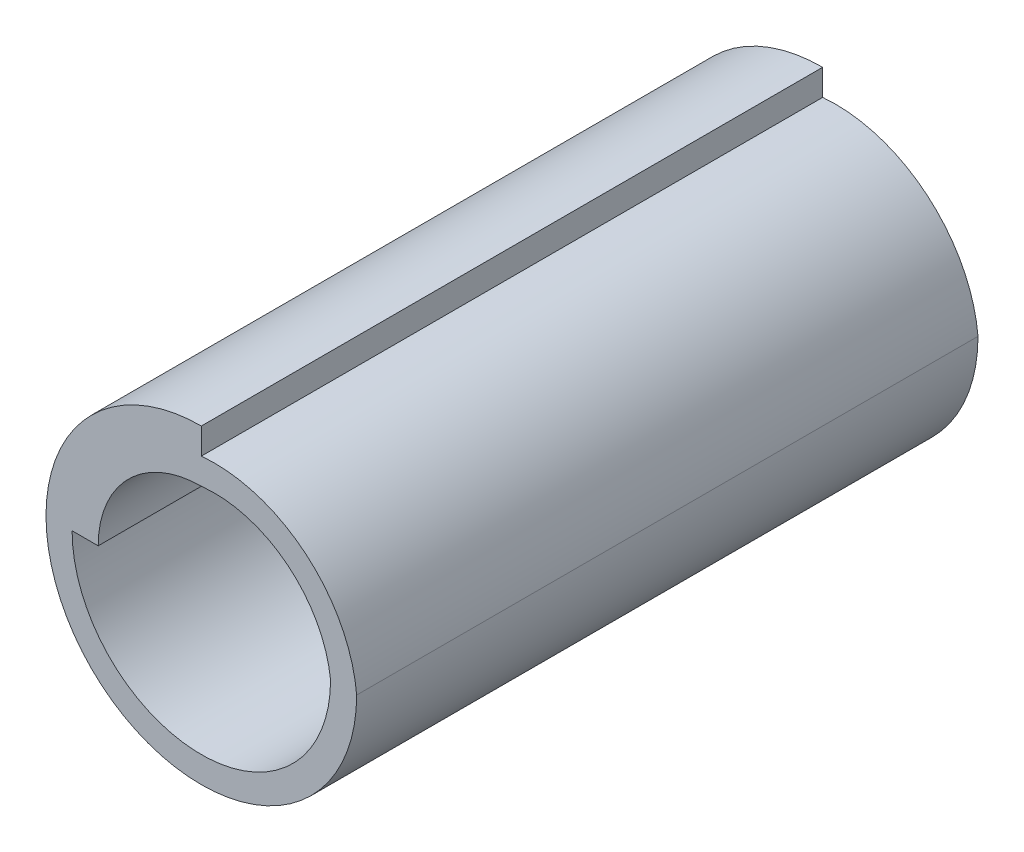
ISO-10303-21;
HEADER;
FILE_DESCRIPTION(('STEP AP214'),'2;1');
FILE_NAME('part.step','',(''),(''),'','','');
FILE_SCHEMA(('AUTOMOTIVE_DESIGN { 1 0 10303 214 1 1 1 1 }'));
ENDSEC;
DATA;
#1=APPLICATION_CONTEXT('core data for automotive mechanical design processes');
#2=APPLICATION_PROTOCOL_DEFINITION('international standard','automotive_design',2000,#1);
#3=PRODUCT_CONTEXT('',#1,'mechanical');
#4=PRODUCT('Part','Part','',(#3));
#5=PRODUCT_RELATED_PRODUCT_CATEGORY('part','',(#4));
#6=PRODUCT_DEFINITION_FORMATION('','',#4);
#7=PRODUCT_DEFINITION_CONTEXT('part definition',#1,'design');
#8=PRODUCT_DEFINITION('design','',#6,#7);
#9=PRODUCT_DEFINITION_SHAPE('','',#8);
#10=(LENGTH_UNIT() NAMED_UNIT(*) SI_UNIT(.MILLI.,.METRE.));
#11=(NAMED_UNIT(*) PLANE_ANGLE_UNIT() SI_UNIT($,.RADIAN.));
#12=(NAMED_UNIT(*) SI_UNIT($,.STERADIAN.) SOLID_ANGLE_UNIT());
#13=UNCERTAINTY_MEASURE_WITH_UNIT(LENGTH_MEASURE(1.E-05),#10,'distance_accuracy_value','');
#14=(GEOMETRIC_REPRESENTATION_CONTEXT(3) GLOBAL_UNCERTAINTY_ASSIGNED_CONTEXT((#13)) GLOBAL_UNIT_ASSIGNED_CONTEXT((#10,
#11,#12)) REPRESENTATION_CONTEXT('',''));
#15=CARTESIAN_POINT('',(0.,0.,0.));
#16=DIRECTION('',(0.,0.,1.));
#17=DIRECTION('',(1.,0.,0.));
#18=AXIS2_PLACEMENT_3D('',#15,#16,#17);
#19=CARTESIAN_POINT('',(0.420000000000019,-0.419999999999977,10.));
#20=DIRECTION('',(0.,0.,1.));
#21=DIRECTION('',(1.,0.,0.));
#22=AXIS2_PLACEMENT_3D('',#19,#20,#21);
#23=PLANE('',#22);
#24=CARTESIAN_POINT('',(0.420000000000019,-0.419999999999977,10.));
#25=DIRECTION('',(0.,0.,1.));
#26=DIRECTION('',(1.,0.,0.));
#27=AXIS2_PLACEMENT_3D('',#24,#25,#26);
#28=CIRCLE('',#27,4.59921732471948);
#29=CARTESIAN_POINT('',(5.,0.,10.));
#30=VERTEX_POINT('',#29);
#31=CARTESIAN_POINT('',(0.,4.16,10.));
#32=VERTEX_POINT('',#31);
#33=EDGE_CURVE('E134',#30,#32,#28,.T.);
#34=ORIENTED_EDGE('',*,*,#33,.T.);
#35=DIRECTION('',(0.,1.,0.));
#36=VECTOR('',#35,1.);
#37=CARTESIAN_POINT('',(0.,4.16,10.));
#38=LINE('',#37,#36);
#39=CARTESIAN_POINT('',(0.,5.,10.));
#40=VERTEX_POINT('',#39);
#41=EDGE_CURVE('E137',#32,#40,#38,.T.);
#42=ORIENTED_EDGE('',*,*,#41,.T.);
#43=CARTESIAN_POINT('',(0.,0.,10.));
#44=DIRECTION('',(0.,0.,1.));
#45=DIRECTION('',(1.,0.,0.));
#46=AXIS2_PLACEMENT_3D('',#43,#44,#45);
#47=CIRCLE('',#46,5.);
#48=EDGE_CURVE('E140',#40,#30,#47,.T.);
#49=ORIENTED_EDGE('',*,*,#48,.T.);
#50=EDGE_LOOP('',(#34,#42,#49));
#51=FACE_BOUND('',#50,.T.);
#52=CARTESIAN_POINT('',(0.420000000000019,-0.419999999999977,10.));
#53=DIRECTION('',(0.,0.,1.));
#54=DIRECTION('',(1.,0.,0.));
#55=AXIS2_PLACEMENT_3D('',#52,#53,#54);
#56=CIRCLE('',#55,3.7635090009192);
#57=CARTESIAN_POINT('',(4.16,0.,10.));
#58=VERTEX_POINT('',#57);
#59=CARTESIAN_POINT('',(0.,3.32,10.));
#60=VERTEX_POINT('',#59);
#61=EDGE_CURVE('E106',#58,#60,#56,.T.);
#62=ORIENTED_EDGE('',*,*,#61,.F.);
#63=CARTESIAN_POINT('',(0.,0.,10.));
#64=DIRECTION('',(0.,0.,1.));
#65=DIRECTION('',(1.,0.,0.));
#66=AXIS2_PLACEMENT_3D('',#63,#64,#65);
#67=CIRCLE('',#66,4.16);
#68=CARTESIAN_POINT('',(-4.16,0.,10.));
#69=VERTEX_POINT('',#68);
#70=EDGE_CURVE('E98',#69,#58,#67,.T.);
#71=ORIENTED_EDGE('',*,*,#70,.F.);
#72=DIRECTION('',(-1.,0.,0.));
#73=VECTOR('',#72,1.);
#74=CARTESIAN_POINT('',(-4.16,0.,10.));
#75=LINE('',#74,#73);
#76=CARTESIAN_POINT('',(-3.32,0.,10.));
#77=VERTEX_POINT('',#76);
#78=EDGE_CURVE('E120',#77,#69,#75,.T.);
#79=ORIENTED_EDGE('',*,*,#78,.F.);
#80=CARTESIAN_POINT('',(0.,0.,10.));
#81=DIRECTION('',(0.,0.,1.));
#82=DIRECTION('',(1.,0.,0.));
#83=AXIS2_PLACEMENT_3D('',#80,#81,#82);
#84=CIRCLE('',#83,3.32);
#85=EDGE_CURVE('E118',#60,#77,#84,.T.);
#86=ORIENTED_EDGE('',*,*,#85,.F.);
#87=EDGE_LOOP('',(#62,#71,#79,#86));
#88=FACE_BOUND('',#87,.T.);
#89=ADVANCED_FACE('F39',(#51,#88),#23,.T.);
#90=CARTESIAN_POINT('',(0.420000000000019,-0.419999999999977,-10.));
#91=DIRECTION('',(0.,0.,1.));
#92=DIRECTION('',(1.,0.,0.));
#93=AXIS2_PLACEMENT_3D('',#90,#91,#92);
#94=PLANE('',#93);
#95=CARTESIAN_POINT('',(0.420000000000019,-0.419999999999977,-10.));
#96=DIRECTION('',(0.,0.,1.));
#97=DIRECTION('',(1.,0.,0.));
#98=AXIS2_PLACEMENT_3D('',#95,#96,#97);
#99=CIRCLE('',#98,4.59921732471948);
#100=CARTESIAN_POINT('',(5.,0.,-10.));
#101=VERTEX_POINT('',#100);
#102=CARTESIAN_POINT('',(0.,4.16,-10.));
#103=VERTEX_POINT('',#102);
#104=EDGE_CURVE('E114',#101,#103,#99,.T.);
#105=ORIENTED_EDGE('',*,*,#104,.F.);
#106=CARTESIAN_POINT('',(0.,0.,-10.));
#107=DIRECTION('',(0.,0.,1.));
#108=DIRECTION('',(1.,0.,0.));
#109=AXIS2_PLACEMENT_3D('',#106,#107,#108);
#110=CIRCLE('',#109,5.);
#111=CARTESIAN_POINT('',(0.,5.,-10.));
#112=VERTEX_POINT('',#111);
#113=EDGE_CURVE('E138',#112,#101,#110,.T.);
#114=ORIENTED_EDGE('',*,*,#113,.F.);
#115=DIRECTION('',(0.,1.,0.));
#116=VECTOR('',#115,1.);
#117=CARTESIAN_POINT('',(0.,4.16,-10.));
#118=LINE('',#117,#116);
#119=EDGE_CURVE('E145',#103,#112,#118,.T.);
#120=ORIENTED_EDGE('',*,*,#119,.F.);
#121=EDGE_LOOP('',(#105,#114,#120));
#122=FACE_BOUND('',#121,.T.);
#123=CARTESIAN_POINT('',(0.,0.,-10.));
#124=DIRECTION('',(0.,0.,1.));
#125=DIRECTION('',(1.,0.,0.));
#126=AXIS2_PLACEMENT_3D('',#123,#124,#125);
#127=CIRCLE('',#126,4.16);
#128=CARTESIAN_POINT('',(-4.16,0.,-10.));
#129=VERTEX_POINT('',#128);
#130=CARTESIAN_POINT('',(4.16,0.,-10.));
#131=VERTEX_POINT('',#130);
#132=EDGE_CURVE('E62',#129,#131,#127,.T.);
#133=ORIENTED_EDGE('',*,*,#132,.T.);
#134=CARTESIAN_POINT('',(0.420000000000019,-0.419999999999977,-10.));
#135=DIRECTION('',(0.,0.,1.));
#136=DIRECTION('',(1.,0.,0.));
#137=AXIS2_PLACEMENT_3D('',#134,#135,#136);
#138=CIRCLE('',#137,3.7635090009192);
#139=CARTESIAN_POINT('',(0.,3.32,-10.));
#140=VERTEX_POINT('',#139);
#141=EDGE_CURVE('E113',#131,#140,#138,.T.);
#142=ORIENTED_EDGE('',*,*,#141,.T.);
#143=CARTESIAN_POINT('',(0.,0.,-10.));
#144=DIRECTION('',(0.,0.,1.));
#145=DIRECTION('',(1.,0.,0.));
#146=AXIS2_PLACEMENT_3D('',#143,#144,#145);
#147=CIRCLE('',#146,3.32);
#148=CARTESIAN_POINT('',(-3.32,0.,-10.));
#149=VERTEX_POINT('',#148);
#150=EDGE_CURVE('E126',#140,#149,#147,.T.);
#151=ORIENTED_EDGE('',*,*,#150,.T.);
#152=DIRECTION('',(-1.,0.,0.));
#153=VECTOR('',#152,1.);
#154=CARTESIAN_POINT('',(-4.16,0.,-10.));
#155=LINE('',#154,#153);
#156=EDGE_CURVE('E107',#149,#129,#155,.T.);
#157=ORIENTED_EDGE('',*,*,#156,.T.);
#158=EDGE_LOOP('',(#133,#142,#151,#157));
#159=FACE_BOUND('',#158,.T.);
#160=ADVANCED_FACE('F159',(#122,#159),#94,.F.);
#161=CARTESIAN_POINT('',(0.420000000000019,-0.419999999999977,10.));
#162=DIRECTION('',(0.,0.,-1.));
#163=DIRECTION('',(-1.,0.,0.));
#164=AXIS2_PLACEMENT_3D('',#161,#162,#163);
#165=CYLINDRICAL_SURFACE('',#164,4.59921732471948);
#166=ORIENTED_EDGE('',*,*,#104,.T.);
#167=DIRECTION('',(0.,0.,-1.));
#168=VECTOR('',#167,1.);
#169=CARTESIAN_POINT('',(0.,4.16,10.));
#170=LINE('',#169,#168);
#171=EDGE_CURVE('E11',#32,#103,#170,.T.);
#172=ORIENTED_EDGE('',*,*,#171,.F.);
#173=ORIENTED_EDGE('',*,*,#33,.F.);
#174=DIRECTION('',(0.,0.,-1.));
#175=VECTOR('',#174,1.);
#176=CARTESIAN_POINT('',(5.,0.,10.));
#177=LINE('',#176,#175);
#178=EDGE_CURVE('E142',#30,#101,#177,.T.);
#179=ORIENTED_EDGE('',*,*,#178,.T.);
#180=EDGE_LOOP('',(#166,#172,#173,#179));
#181=FACE_BOUND('',#180,.T.);
#182=ADVANCED_FACE('F41',(#181),#165,.T.);
#183=CARTESIAN_POINT('',(0.,4.16,10.));
#184=DIRECTION('',(-1.,0.,0.));
#185=DIRECTION('',(0.,0.,1.));
#186=AXIS2_PLACEMENT_3D('',#183,#184,#185);
#187=PLANE('',#186);
#188=ORIENTED_EDGE('',*,*,#119,.T.);
#189=DIRECTION('',(0.,0.,-1.));
#190=VECTOR('',#189,1.);
#191=CARTESIAN_POINT('',(0.,5.,10.));
#192=LINE('',#191,#190);
#193=EDGE_CURVE('E47',#40,#112,#192,.T.);
#194=ORIENTED_EDGE('',*,*,#193,.F.);
#195=ORIENTED_EDGE('',*,*,#41,.F.);
#196=ORIENTED_EDGE('',*,*,#171,.T.);
#197=EDGE_LOOP('',(#188,#194,#195,#196));
#198=FACE_BOUND('',#197,.T.);
#199=ADVANCED_FACE('F165',(#198),#187,.F.);
#200=CARTESIAN_POINT('',(0.,0.,10.));
#201=DIRECTION('',(0.,0.,-1.));
#202=DIRECTION('',(-1.,0.,0.));
#203=AXIS2_PLACEMENT_3D('',#200,#201,#202);
#204=CYLINDRICAL_SURFACE('',#203,5.);
#205=ORIENTED_EDGE('',*,*,#113,.T.);
#206=ORIENTED_EDGE('',*,*,#178,.F.);
#207=ORIENTED_EDGE('',*,*,#48,.F.);
#208=ORIENTED_EDGE('',*,*,#193,.T.);
#209=EDGE_LOOP('',(#205,#206,#207,#208));
#210=FACE_BOUND('',#209,.T.);
#211=ADVANCED_FACE('F154',(#210),#204,.T.);
#212=CARTESIAN_POINT('',(0.,0.,10.));
#213=DIRECTION('',(0.,0.,-1.));
#214=DIRECTION('',(-1.,0.,0.));
#215=AXIS2_PLACEMENT_3D('',#212,#213,#214);
#216=CYLINDRICAL_SURFACE('',#215,4.16);
#217=ORIENTED_EDGE('',*,*,#132,.F.);
#218=DIRECTION('',(0.,0.,-1.));
#219=VECTOR('',#218,1.);
#220=CARTESIAN_POINT('',(-4.16,0.,10.));
#221=LINE('',#220,#219);
#222=EDGE_CURVE('E102',#69,#129,#221,.T.);
#223=ORIENTED_EDGE('',*,*,#222,.F.);
#224=ORIENTED_EDGE('',*,*,#70,.T.);
#225=DIRECTION('',(0.,0.,-1.));
#226=VECTOR('',#225,1.);
#227=CARTESIAN_POINT('',(4.16,0.,10.));
#228=LINE('',#227,#226);
#229=EDGE_CURVE('E101',#58,#131,#228,.T.);
#230=ORIENTED_EDGE('',*,*,#229,.T.);
#231=EDGE_LOOP('',(#217,#223,#224,#230));
#232=FACE_BOUND('',#231,.T.);
#233=ADVANCED_FACE('F100',(#232),#216,.F.);
#234=CARTESIAN_POINT('',(0.420000000000019,-0.419999999999977,10.));
#235=DIRECTION('',(0.,0.,-1.));
#236=DIRECTION('',(-1.,0.,0.));
#237=AXIS2_PLACEMENT_3D('',#234,#235,#236);
#238=CYLINDRICAL_SURFACE('',#237,3.7635090009192);
#239=ORIENTED_EDGE('',*,*,#141,.F.);
#240=ORIENTED_EDGE('',*,*,#229,.F.);
#241=ORIENTED_EDGE('',*,*,#61,.T.);
#242=DIRECTION('',(0.,0.,-1.));
#243=VECTOR('',#242,1.);
#244=CARTESIAN_POINT('',(0.,3.32,10.));
#245=LINE('',#244,#243);
#246=EDGE_CURVE('E115',#60,#140,#245,.T.);
#247=ORIENTED_EDGE('',*,*,#246,.T.);
#248=EDGE_LOOP('',(#239,#240,#241,#247));
#249=FACE_BOUND('',#248,.T.);
#250=ADVANCED_FACE('F110',(#249),#238,.F.);
#251=CARTESIAN_POINT('',(0.,0.,10.));
#252=DIRECTION('',(0.,0.,-1.));
#253=DIRECTION('',(-1.,0.,0.));
#254=AXIS2_PLACEMENT_3D('',#251,#252,#253);
#255=CYLINDRICAL_SURFACE('',#254,3.32);
#256=ORIENTED_EDGE('',*,*,#150,.F.);
#257=ORIENTED_EDGE('',*,*,#246,.F.);
#258=ORIENTED_EDGE('',*,*,#85,.T.);
#259=DIRECTION('',(0.,0.,-1.));
#260=VECTOR('',#259,1.);
#261=CARTESIAN_POINT('',(-3.32,0.,10.));
#262=LINE('',#261,#260);
#263=EDGE_CURVE('E54',#77,#149,#262,.T.);
#264=ORIENTED_EDGE('',*,*,#263,.T.);
#265=EDGE_LOOP('',(#256,#257,#258,#264));
#266=FACE_BOUND('',#265,.T.);
#267=ADVANCED_FACE('F183',(#266),#255,.F.);
#268=CARTESIAN_POINT('',(-4.16,0.,10.));
#269=DIRECTION('',(0.,-1.,0.));
#270=DIRECTION('',(0.,0.,-1.));
#271=AXIS2_PLACEMENT_3D('',#268,#269,#270);
#272=PLANE('',#271);
#273=ORIENTED_EDGE('',*,*,#156,.F.);
#274=ORIENTED_EDGE('',*,*,#263,.F.);
#275=ORIENTED_EDGE('',*,*,#78,.T.);
#276=ORIENTED_EDGE('',*,*,#222,.T.);
#277=EDGE_LOOP('',(#273,#274,#275,#276));
#278=FACE_BOUND('',#277,.T.);
#279=ADVANCED_FACE('F186',(#278),#272,.T.);
#280=CLOSED_SHELL('',(#89,#160,#182,#199,#211,#233,#250,#267,#279));
#281=MANIFOLD_SOLID_BREP('B2',#280);
#282=ADVANCED_BREP_SHAPE_REPRESENTATION('',(#18,#281),#14);
#283=SHAPE_DEFINITION_REPRESENTATION(#9,#282);
ENDSEC;
END-ISO-10303-21;
